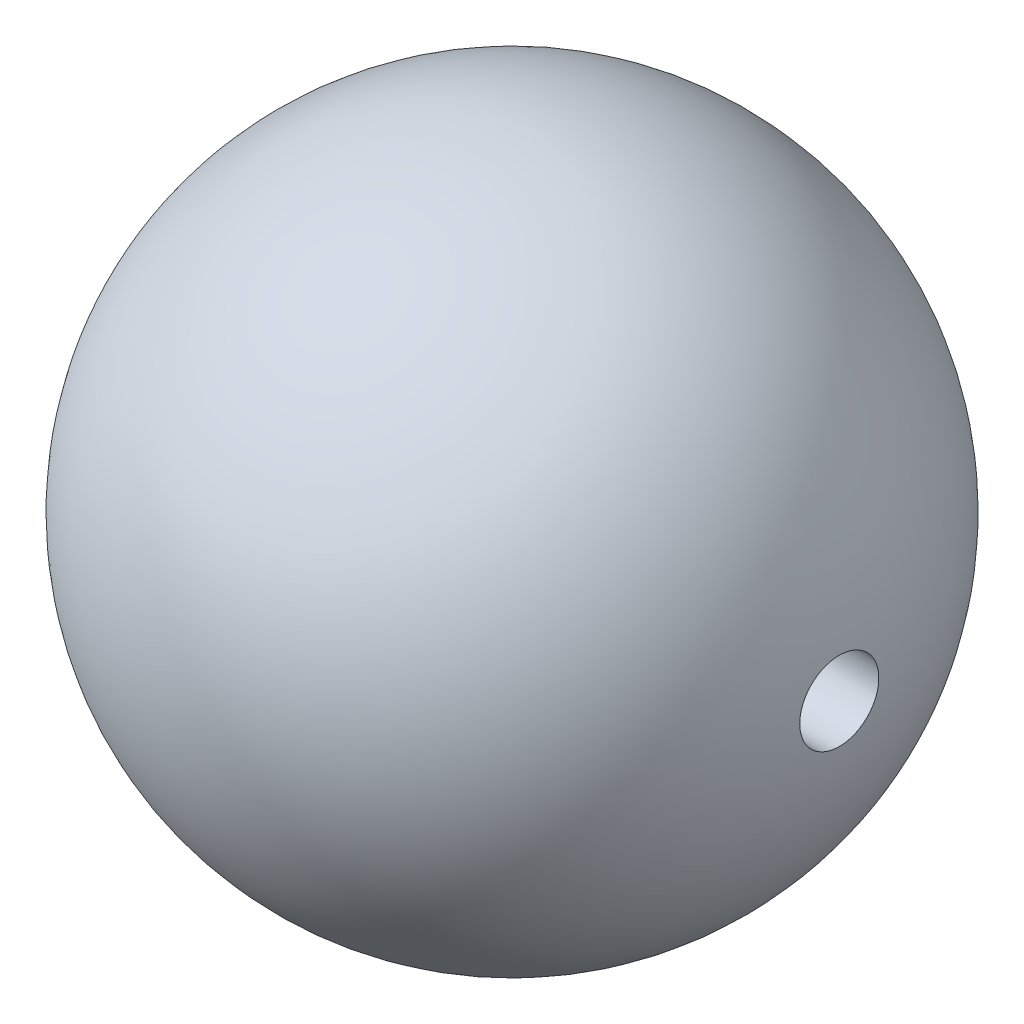
ISO-10303-21;
HEADER;
FILE_DESCRIPTION(('STEP AP214'),'2;1');
FILE_NAME('part.step','',(''),(''),'','','');
FILE_SCHEMA(('AUTOMOTIVE_DESIGN { 1 0 10303 214 1 1 1 1 }'));
ENDSEC;
DATA;
#1=APPLICATION_CONTEXT('core data for automotive mechanical design processes');
#2=APPLICATION_PROTOCOL_DEFINITION('international standard','automotive_design',2000,#1);
#3=PRODUCT_CONTEXT('',#1,'mechanical');
#4=PRODUCT('Part','Part','',(#3));
#5=PRODUCT_RELATED_PRODUCT_CATEGORY('part','',(#4));
#6=PRODUCT_DEFINITION_FORMATION('','',#4);
#7=PRODUCT_DEFINITION_CONTEXT('part definition',#1,'design');
#8=PRODUCT_DEFINITION('design','',#6,#7);
#9=PRODUCT_DEFINITION_SHAPE('','',#8);
#10=(LENGTH_UNIT() NAMED_UNIT(*) SI_UNIT(.MILLI.,.METRE.));
#11=(NAMED_UNIT(*) PLANE_ANGLE_UNIT() SI_UNIT($,.RADIAN.));
#12=(NAMED_UNIT(*) SI_UNIT($,.STERADIAN.) SOLID_ANGLE_UNIT());
#13=UNCERTAINTY_MEASURE_WITH_UNIT(LENGTH_MEASURE(1.E-05),#10,'distance_accuracy_value','');
#14=(GEOMETRIC_REPRESENTATION_CONTEXT(3) GLOBAL_UNCERTAINTY_ASSIGNED_CONTEXT((#13)) GLOBAL_UNIT_ASSIGNED_CONTEXT((#10,
#11,#12)) REPRESENTATION_CONTEXT('',''));
#15=CARTESIAN_POINT('',(0.,0.,0.));
#16=DIRECTION('',(0.,0.,1.));
#17=DIRECTION('',(1.,0.,0.));
#18=AXIS2_PLACEMENT_3D('',#15,#16,#17);
#19=CARTESIAN_POINT('',(0.,0.,0.));
#20=DIRECTION('',(0.,1.,0.));
#21=DIRECTION('',(1.,0.,0.));
#22=AXIS2_PLACEMENT_3D('',#19,#20,#21);
#23=SPHERICAL_SURFACE('',#22,12.5);
#24=CARTESIAN_POINT('',(0.,0.,0.));
#25=DIRECTION('',(-1.,0.,0.));
#26=DIRECTION('',(0.,0.,1.));
#27=AXIS2_PLACEMENT_3D('',#24,#25,#26);
#28=SPHERICAL_SURFACE('',#27,12.5);
#29=CARTESIAN_POINT('',(12.4096736459909,0.,0.));
#30=DIRECTION('',(-1.,0.,0.));
#31=DIRECTION('',(0.,0.,1.));
#32=AXIS2_PLACEMENT_3D('',#29,#30,#31);
#33=CIRCLE('',#32,1.5);
#34=CARTESIAN_POINT('',(12.4096736459909,0.,1.5));
#35=VERTEX_POINT('',#34);
#36=EDGE_CURVE('E10',#35,#35,#33,.T.);
#37=ORIENTED_EDGE('',*,*,#36,.T.);
#38=EDGE_LOOP('',(#37));
#39=FACE_BOUND('',#38,.T.);
#40=CARTESIAN_POINT('',(-12.4096736459909,0.,0.));
#41=DIRECTION('',(1.,0.,0.));
#42=DIRECTION('',(0.,0.,-1.));
#43=AXIS2_PLACEMENT_3D('',#40,#41,#42);
#44=CIRCLE('',#43,1.5);
#45=CARTESIAN_POINT('',(-12.4096736459909,0.,-1.5));
#46=VERTEX_POINT('',#45);
#47=EDGE_CURVE('E49',#46,#46,#44,.T.);
#48=ORIENTED_EDGE('',*,*,#47,.T.);
#49=EDGE_LOOP('',(#48));
#50=FACE_BOUND('',#49,.T.);
#51=ADVANCED_FACE('F42',(#39,#50),#28,.T.);
#52=CARTESIAN_POINT('',(-12.5,0.,0.));
#53=DIRECTION('',(1.,0.,0.));
#54=DIRECTION('',(0.,0.,-1.));
#55=AXIS2_PLACEMENT_3D('',#52,#53,#54);
#56=CYLINDRICAL_SURFACE('',#55,1.5);
#57=ORIENTED_EDGE('',*,*,#47,.F.);
#58=EDGE_LOOP('',(#57));
#59=FACE_BOUND('',#58,.T.);
#60=ORIENTED_EDGE('',*,*,#36,.F.);
#61=EDGE_LOOP('',(#60));
#62=FACE_BOUND('',#61,.T.);
#63=ADVANCED_FACE('F57',(#59,#62),#56,.F.);
#64=CLOSED_SHELL('',(#51,#63));
#65=MANIFOLD_SOLID_BREP('B2',#64);
#66=ADVANCED_BREP_SHAPE_REPRESENTATION('',(#18,#65),#14);
#67=SHAPE_DEFINITION_REPRESENTATION(#9,#66);
ENDSEC;
END-ISO-10303-21;
